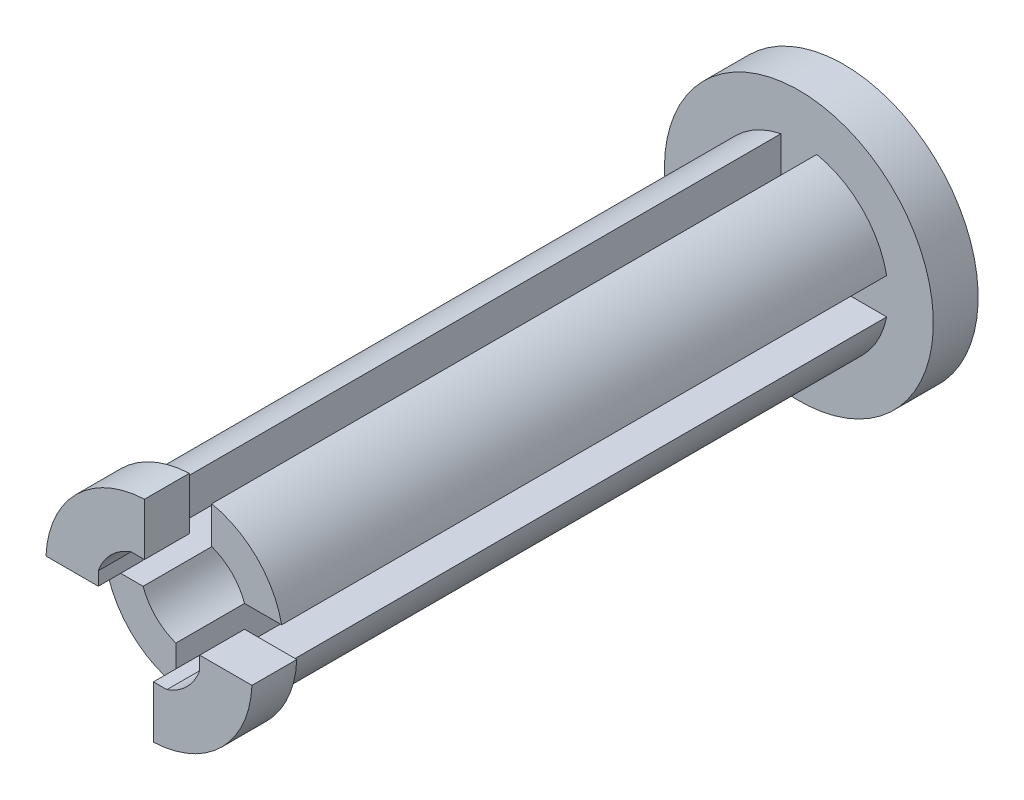
ISO-10303-21;
HEADER;
FILE_DESCRIPTION(('STEP AP214'),'2;1');
FILE_NAME('part.step','',(''),(''),'','','');
FILE_SCHEMA(('AUTOMOTIVE_DESIGN { 1 0 10303 214 1 1 1 1 }'));
ENDSEC;
DATA;
#1=APPLICATION_CONTEXT('core data for automotive mechanical design processes');
#2=APPLICATION_PROTOCOL_DEFINITION('international standard','automotive_design',2000,#1);
#3=PRODUCT_CONTEXT('',#1,'mechanical');
#4=PRODUCT('Part','Part','',(#3));
#5=PRODUCT_RELATED_PRODUCT_CATEGORY('part','',(#4));
#6=PRODUCT_DEFINITION_FORMATION('','',#4);
#7=PRODUCT_DEFINITION_CONTEXT('part definition',#1,'design');
#8=PRODUCT_DEFINITION('design','',#6,#7);
#9=PRODUCT_DEFINITION_SHAPE('','',#8);
#10=(LENGTH_UNIT() NAMED_UNIT(*) SI_UNIT(.MILLI.,.METRE.));
#11=(NAMED_UNIT(*) PLANE_ANGLE_UNIT() SI_UNIT($,.RADIAN.));
#12=(NAMED_UNIT(*) SI_UNIT($,.STERADIAN.) SOLID_ANGLE_UNIT());
#13=UNCERTAINTY_MEASURE_WITH_UNIT(LENGTH_MEASURE(1.E-05),#10,'distance_accuracy_value','');
#14=(GEOMETRIC_REPRESENTATION_CONTEXT(3) GLOBAL_UNCERTAINTY_ASSIGNED_CONTEXT((#13)) GLOBAL_UNIT_ASSIGNED_CONTEXT((#10,
#11,#12)) REPRESENTATION_CONTEXT('',''));
#15=CARTESIAN_POINT('',(0.,0.,0.));
#16=DIRECTION('',(0.,0.,1.));
#17=DIRECTION('',(1.,0.,0.));
#18=AXIS2_PLACEMENT_3D('',#15,#16,#17);
#19=CARTESIAN_POINT('',(0.,0.,0.));
#20=DIRECTION('',(0.,0.,-1.));
#21=DIRECTION('',(-1.,0.,0.));
#22=AXIS2_PLACEMENT_3D('',#19,#20,#21);
#23=PLANE('',#22);
#24=DIRECTION('',(0.,1.,0.));
#25=VECTOR('',#24,1.);
#26=CARTESIAN_POINT('',(0.4,0.,0.));
#27=LINE('',#26,#25);
#28=CARTESIAN_POINT('',(0.4,1.13137084989848,0.));
#29=VERTEX_POINT('',#28);
#30=CARTESIAN_POINT('',(0.4,1.95959179422654,0.));
#31=VERTEX_POINT('',#30);
#32=EDGE_CURVE('E341',#29,#31,#27,.T.);
#33=ORIENTED_EDGE('',*,*,#32,.T.);
#34=CARTESIAN_POINT('',(0.,0.,0.));
#35=DIRECTION('',(0.,0.,1.));
#36=DIRECTION('',(1.,0.,0.));
#37=AXIS2_PLACEMENT_3D('',#34,#35,#36);
#38=CIRCLE('',#37,2.);
#39=CARTESIAN_POINT('',(1.95959179422654,0.4,0.));
#40=VERTEX_POINT('',#39);
#41=EDGE_CURVE('E337',#40,#31,#38,.T.);
#42=ORIENTED_EDGE('',*,*,#41,.F.);
#43=DIRECTION('',(1.,0.,0.));
#44=VECTOR('',#43,1.);
#45=CARTESIAN_POINT('',(0.,0.4,0.));
#46=LINE('',#45,#44);
#47=CARTESIAN_POINT('',(1.13137084989848,0.4,0.));
#48=VERTEX_POINT('',#47);
#49=EDGE_CURVE('E340',#48,#40,#46,.T.);
#50=ORIENTED_EDGE('',*,*,#49,.F.);
#51=CARTESIAN_POINT('',(0.,0.,0.));
#52=DIRECTION('',(0.,0.,1.));
#53=DIRECTION('',(1.,0.,0.));
#54=AXIS2_PLACEMENT_3D('',#51,#52,#53);
#55=CIRCLE('',#54,1.2);
#56=EDGE_CURVE('E330',#48,#29,#55,.T.);
#57=ORIENTED_EDGE('',*,*,#56,.T.);
#58=EDGE_LOOP('',(#33,#42,#50,#57));
#59=FACE_BOUND('',#58,.T.);
#60=DIRECTION('',(1.,0.,0.));
#61=VECTOR('',#60,1.);
#62=CARTESIAN_POINT('',(0.,0.4,0.));
#63=LINE('',#62,#61);
#64=CARTESIAN_POINT('',(-1.95959179422654,0.4,0.));
#65=VERTEX_POINT('',#64);
#66=CARTESIAN_POINT('',(-1.13137084989848,0.4,0.));
#67=VERTEX_POINT('',#66);
#68=EDGE_CURVE('E49',#65,#67,#63,.T.);
#69=ORIENTED_EDGE('',*,*,#68,.F.);
#70=CARTESIAN_POINT('',(0.,0.,0.));
#71=DIRECTION('',(0.,0.,1.));
#72=DIRECTION('',(1.,0.,0.));
#73=AXIS2_PLACEMENT_3D('',#70,#71,#72);
#74=CIRCLE('',#73,2.);
#75=CARTESIAN_POINT('',(-0.4,1.95959179422654,0.));
#76=VERTEX_POINT('',#75);
#77=EDGE_CURVE('E441',#76,#65,#74,.T.);
#78=ORIENTED_EDGE('',*,*,#77,.F.);
#79=DIRECTION('',(0.,1.,0.));
#80=VECTOR('',#79,1.);
#81=CARTESIAN_POINT('',(-0.4,0.,0.));
#82=LINE('',#81,#80);
#83=CARTESIAN_POINT('',(-0.4,1.13137084989848,0.));
#84=VERTEX_POINT('',#83);
#85=EDGE_CURVE('E440',#84,#76,#82,.T.);
#86=ORIENTED_EDGE('',*,*,#85,.F.);
#87=CARTESIAN_POINT('',(0.,0.,0.));
#88=DIRECTION('',(0.,0.,1.));
#89=DIRECTION('',(1.,0.,0.));
#90=AXIS2_PLACEMENT_3D('',#87,#88,#89);
#91=CIRCLE('',#90,1.2);
#92=EDGE_CURVE('E43',#84,#67,#91,.T.);
#93=ORIENTED_EDGE('',*,*,#92,.T.);
#94=EDGE_LOOP('',(#69,#78,#86,#93));
#95=FACE_BOUND('',#94,.T.);
#96=CARTESIAN_POINT('',(0.,0.,0.));
#97=DIRECTION('',(0.,0.,-1.));
#98=DIRECTION('',(-1.,0.,0.));
#99=AXIS2_PLACEMENT_3D('',#96,#97,#98);
#100=CIRCLE('',#99,3.);
#101=CARTESIAN_POINT('',(-3.,0.,0.));
#102=VERTEX_POINT('',#101);
#103=EDGE_CURVE('E352',#102,#102,#100,.T.);
#104=ORIENTED_EDGE('',*,*,#103,.F.);
#105=EDGE_LOOP('',(#104));
#106=FACE_BOUND('',#105,.T.);
#107=CARTESIAN_POINT('',(0.,0.,0.));
#108=DIRECTION('',(0.,0.,1.));
#109=DIRECTION('',(1.,0.,0.));
#110=AXIS2_PLACEMENT_3D('',#107,#108,#109);
#111=CIRCLE('',#110,1.2);
#112=CARTESIAN_POINT('',(-1.13137084989848,-0.4,0.));
#113=VERTEX_POINT('',#112);
#114=CARTESIAN_POINT('',(-0.4,-1.13137084989848,0.));
#115=VERTEX_POINT('',#114);
#116=EDGE_CURVE('E293',#113,#115,#111,.T.);
#117=ORIENTED_EDGE('',*,*,#116,.T.);
#118=DIRECTION('',(0.,1.,0.));
#119=VECTOR('',#118,1.);
#120=CARTESIAN_POINT('',(-0.4,0.,0.));
#121=LINE('',#120,#119);
#122=CARTESIAN_POINT('',(-0.4,-1.95959179422654,0.));
#123=VERTEX_POINT('',#122);
#124=EDGE_CURVE('E303',#123,#115,#121,.T.);
#125=ORIENTED_EDGE('',*,*,#124,.F.);
#126=CARTESIAN_POINT('',(0.,0.,0.));
#127=DIRECTION('',(0.,0.,1.));
#128=DIRECTION('',(1.,0.,0.));
#129=AXIS2_PLACEMENT_3D('',#126,#127,#128);
#130=CIRCLE('',#129,2.);
#131=CARTESIAN_POINT('',(-1.95959179422654,-0.4,0.));
#132=VERTEX_POINT('',#131);
#133=EDGE_CURVE('E279',#132,#123,#130,.T.);
#134=ORIENTED_EDGE('',*,*,#133,.F.);
#135=DIRECTION('',(1.,0.,0.));
#136=VECTOR('',#135,1.);
#137=CARTESIAN_POINT('',(0.,-0.4,0.));
#138=LINE('',#137,#136);
#139=EDGE_CURVE('E297',#132,#113,#138,.T.);
#140=ORIENTED_EDGE('',*,*,#139,.T.);
#141=EDGE_LOOP('',(#117,#125,#134,#140));
#142=FACE_BOUND('',#141,.T.);
#143=DIRECTION('',(1.,0.,0.));
#144=VECTOR('',#143,1.);
#145=CARTESIAN_POINT('',(0.,-0.4,0.));
#146=LINE('',#145,#144);
#147=CARTESIAN_POINT('',(1.13137084989848,-0.4,0.));
#148=VERTEX_POINT('',#147);
#149=CARTESIAN_POINT('',(1.95959179422654,-0.4,0.));
#150=VERTEX_POINT('',#149);
#151=EDGE_CURVE('E61',#148,#150,#146,.T.);
#152=ORIENTED_EDGE('',*,*,#151,.T.);
#153=CARTESIAN_POINT('',(0.,0.,0.));
#154=DIRECTION('',(0.,0.,1.));
#155=DIRECTION('',(1.,0.,0.));
#156=AXIS2_PLACEMENT_3D('',#153,#154,#155);
#157=CIRCLE('',#156,2.);
#158=CARTESIAN_POINT('',(0.4,-1.95959179422654,0.));
#159=VERTEX_POINT('',#158);
#160=EDGE_CURVE('E275',#159,#150,#157,.T.);
#161=ORIENTED_EDGE('',*,*,#160,.F.);
#162=DIRECTION('',(0.,1.,0.));
#163=VECTOR('',#162,1.);
#164=CARTESIAN_POINT('',(0.4,0.,0.));
#165=LINE('',#164,#163);
#166=CARTESIAN_POINT('',(0.4,-1.13137084989848,0.));
#167=VERTEX_POINT('',#166);
#168=EDGE_CURVE('E245',#159,#167,#165,.T.);
#169=ORIENTED_EDGE('',*,*,#168,.T.);
#170=CARTESIAN_POINT('',(0.,0.,0.));
#171=DIRECTION('',(0.,0.,1.));
#172=DIRECTION('',(1.,0.,0.));
#173=AXIS2_PLACEMENT_3D('',#170,#171,#172);
#174=CIRCLE('',#173,1.2);
#175=EDGE_CURVE('E57',#167,#148,#174,.T.);
#176=ORIENTED_EDGE('',*,*,#175,.T.);
#177=EDGE_LOOP('',(#152,#161,#169,#176));
#178=FACE_BOUND('',#177,.T.);
#179=ADVANCED_FACE('F39',(#59,#95,#106,#142,#178),#23,.F.);
#180=CARTESIAN_POINT('',(0.,0.,0.));
#181=DIRECTION('',(0.,0.,1.));
#182=DIRECTION('',(1.,0.,0.));
#183=AXIS2_PLACEMENT_3D('',#180,#181,#182);
#184=CYLINDRICAL_SURFACE('',#183,1.2);
#185=DIRECTION('',(0.,0.,1.));
#186=VECTOR('',#185,1.);
#187=CARTESIAN_POINT('',(-1.13137084989848,0.4,0.));
#188=LINE('',#187,#186);
#189=CARTESIAN_POINT('',(-1.13137084989848,0.4,13.5));
#190=VERTEX_POINT('',#189);
#191=EDGE_CURVE('E11',#67,#190,#188,.T.);
#192=ORIENTED_EDGE('',*,*,#191,.F.);
#193=ORIENTED_EDGE('',*,*,#92,.F.);
#194=DIRECTION('',(0.,0.,1.));
#195=VECTOR('',#194,1.);
#196=CARTESIAN_POINT('',(-0.4,1.13137084989848,0.));
#197=LINE('',#196,#195);
#198=CARTESIAN_POINT('',(-0.4,1.13137084989848,13.5));
#199=VERTEX_POINT('',#198);
#200=EDGE_CURVE('E437',#199,#84,#197,.F.);
#201=ORIENTED_EDGE('',*,*,#200,.F.);
#202=DIRECTION('',(0.,0.,-1.));
#203=VECTOR('',#202,1.);
#204=CARTESIAN_POINT('',(-0.4,1.13137084989848,14.5));
#205=LINE('',#204,#203);
#206=CARTESIAN_POINT('',(-0.4,1.13137084989848,14.5));
#207=VERTEX_POINT('',#206);
#208=EDGE_CURVE('E433',#207,#199,#205,.T.);
#209=ORIENTED_EDGE('',*,*,#208,.F.);
#210=CARTESIAN_POINT('',(0.,0.,14.5));
#211=DIRECTION('',(0.,0.,-1.));
#212=DIRECTION('',(1.,0.,0.));
#213=AXIS2_PLACEMENT_3D('',#210,#211,#212);
#214=CIRCLE('',#213,1.2);
#215=CARTESIAN_POINT('',(-1.13137084989848,0.4,14.5));
#216=VERTEX_POINT('',#215);
#217=EDGE_CURVE('E379',#216,#207,#214,.T.);
#218=ORIENTED_EDGE('',*,*,#217,.F.);
#219=DIRECTION('',(0.,0.,-1.));
#220=VECTOR('',#219,1.);
#221=CARTESIAN_POINT('',(-1.13137084989848,0.4,14.5));
#222=LINE('',#221,#220);
#223=EDGE_CURVE('E399',#216,#190,#222,.T.);
#224=ORIENTED_EDGE('',*,*,#223,.T.);
#225=EDGE_LOOP('',(#192,#193,#201,#209,#218,#224));
#226=FACE_BOUND('',#225,.T.);
#227=ADVANCED_FACE('F479',(#226),#184,.F.);
#228=CARTESIAN_POINT('',(0.,0.,13.5));
#229=DIRECTION('',(0.,0.,-1.));
#230=DIRECTION('',(-1.,0.,0.));
#231=AXIS2_PLACEMENT_3D('',#228,#229,#230);
#232=CYLINDRICAL_SURFACE('',#231,2.);
#233=DIRECTION('',(0.,0.,1.));
#234=VECTOR('',#233,1.);
#235=CARTESIAN_POINT('',(-1.95959179422654,0.4,0.));
#236=LINE('',#235,#234);
#237=CARTESIAN_POINT('',(-1.95959179422654,0.4,13.5));
#238=VERTEX_POINT('',#237);
#239=EDGE_CURVE('E450',#65,#238,#236,.T.);
#240=ORIENTED_EDGE('',*,*,#239,.T.);
#241=CARTESIAN_POINT('',(0.,0.,13.5));
#242=DIRECTION('',(0.,0.,1.));
#243=DIRECTION('',(1.,0.,0.));
#244=AXIS2_PLACEMENT_3D('',#241,#242,#243);
#245=CIRCLE('',#244,2.);
#246=CARTESIAN_POINT('',(-0.4,1.95959179422654,13.5));
#247=VERTEX_POINT('',#246);
#248=EDGE_CURVE('E460',#247,#238,#245,.T.);
#249=ORIENTED_EDGE('',*,*,#248,.F.);
#250=DIRECTION('',(0.,0.,1.));
#251=VECTOR('',#250,1.);
#252=CARTESIAN_POINT('',(-0.4,1.95959179422654,0.));
#253=LINE('',#252,#251);
#254=EDGE_CURVE('E442',#76,#247,#253,.T.);
#255=ORIENTED_EDGE('',*,*,#254,.F.);
#256=ORIENTED_EDGE('',*,*,#77,.T.);
#257=EDGE_LOOP('',(#240,#249,#255,#256));
#258=FACE_BOUND('',#257,.T.);
#259=ADVANCED_FACE('F41',(#258),#232,.T.);
#260=CARTESIAN_POINT('',(-0.4,0.,0.));
#261=DIRECTION('',(1.,0.,0.));
#262=DIRECTION('',(0.,0.,-1.));
#263=AXIS2_PLACEMENT_3D('',#260,#261,#262);
#264=PLANE('',#263);
#265=ORIENTED_EDGE('',*,*,#200,.T.);
#266=ORIENTED_EDGE('',*,*,#85,.T.);
#267=ORIENTED_EDGE('',*,*,#254,.T.);
#268=DIRECTION('',(0.,1.,0.));
#269=VECTOR('',#268,1.);
#270=CARTESIAN_POINT('',(-0.4,0.,13.5));
#271=LINE('',#270,#269);
#272=EDGE_CURVE('E446',#199,#247,#271,.T.);
#273=ORIENTED_EDGE('',*,*,#272,.F.);
#274=EDGE_LOOP('',(#265,#266,#267,#273));
#275=FACE_BOUND('',#274,.T.);
#276=ADVANCED_FACE('F489',(#275),#264,.T.);
#277=CARTESIAN_POINT('',(0.,0.4,0.));
#278=DIRECTION('',(0.,-1.,0.));
#279=DIRECTION('',(0.,0.,-1.));
#280=AXIS2_PLACEMENT_3D('',#277,#278,#279);
#281=PLANE('',#280);
#282=DIRECTION('',(1.,0.,0.));
#283=VECTOR('',#282,1.);
#284=CARTESIAN_POINT('',(0.,0.4,13.5));
#285=LINE('',#284,#283);
#286=EDGE_CURVE('E451',#238,#190,#285,.T.);
#287=ORIENTED_EDGE('',*,*,#286,.F.);
#288=ORIENTED_EDGE('',*,*,#239,.F.);
#289=ORIENTED_EDGE('',*,*,#68,.T.);
#290=ORIENTED_EDGE('',*,*,#191,.T.);
#291=EDGE_LOOP('',(#287,#288,#289,#290));
#292=FACE_BOUND('',#291,.T.);
#293=ADVANCED_FACE('F485',(#292),#281,.T.);
#294=CARTESIAN_POINT('',(0.,0.,13.5));
#295=DIRECTION('',(0.,0.,1.));
#296=DIRECTION('',(1.,0.,0.));
#297=AXIS2_PLACEMENT_3D('',#294,#295,#296);
#298=PLANE('',#297);
#299=ORIENTED_EDGE('',*,*,#248,.T.);
#300=ORIENTED_EDGE('',*,*,#286,.T.);
#301=DIRECTION('',(0.,1.,0.));
#302=VECTOR('',#301,1.);
#303=CARTESIAN_POINT('',(-1.13137084989848,0.4,13.5));
#304=LINE('',#303,#302);
#305=CARTESIAN_POINT('',(-1.13137084989848,0.1,13.5));
#306=VERTEX_POINT('',#305);
#307=EDGE_CURVE('E384',#306,#190,#304,.T.);
#308=ORIENTED_EDGE('',*,*,#307,.F.);
#309=DIRECTION('',(1.,0.,0.));
#310=VECTOR('',#309,1.);
#311=CARTESIAN_POINT('',(-2.29782505861521,0.1,13.5));
#312=LINE('',#311,#310);
#313=CARTESIAN_POINT('',(-2.29782505861521,0.1,13.5));
#314=VERTEX_POINT('',#313);
#315=EDGE_CURVE('E408',#314,#306,#312,.T.);
#316=ORIENTED_EDGE('',*,*,#315,.F.);
#317=CARTESIAN_POINT('',(0.,0.,13.5));
#318=DIRECTION('',(0.,0.,1.));
#319=DIRECTION('',(1.,0.,0.));
#320=AXIS2_PLACEMENT_3D('',#317,#318,#319);
#321=CIRCLE('',#320,2.3);
#322=CARTESIAN_POINT('',(-0.0999999999999998,2.29782505861521,13.5));
#323=VERTEX_POINT('',#322);
#324=EDGE_CURVE('E405',#323,#314,#321,.T.);
#325=ORIENTED_EDGE('',*,*,#324,.F.);
#326=DIRECTION('',(0.,1.,0.));
#327=VECTOR('',#326,1.);
#328=CARTESIAN_POINT('',(-0.1,1.13137084989848,13.5));
#329=LINE('',#328,#327);
#330=CARTESIAN_POINT('',(-0.1,1.13137084989848,13.5));
#331=VERTEX_POINT('',#330);
#332=EDGE_CURVE('E402',#331,#323,#329,.T.);
#333=ORIENTED_EDGE('',*,*,#332,.F.);
#334=DIRECTION('',(1.,0.,0.));
#335=VECTOR('',#334,1.);
#336=CARTESIAN_POINT('',(-0.4,1.13137084989848,13.5));
#337=LINE('',#336,#335);
#338=EDGE_CURVE('E375',#199,#331,#337,.T.);
#339=ORIENTED_EDGE('',*,*,#338,.F.);
#340=ORIENTED_EDGE('',*,*,#272,.T.);
#341=EDGE_LOOP('',(#299,#300,#308,#316,#325,#333,#339,#340));
#342=FACE_BOUND('',#341,.T.);
#343=ADVANCED_FACE('F490',(#342),#298,.F.);
#344=CARTESIAN_POINT('',(-0.4,1.13137084989848,14.5));
#345=DIRECTION('',(0.,1.,0.));
#346=DIRECTION('',(-1.,0.,0.));
#347=AXIS2_PLACEMENT_3D('',#344,#345,#346);
#348=PLANE('',#347);
#349=ORIENTED_EDGE('',*,*,#338,.T.);
#350=DIRECTION('',(0.,0.,-1.));
#351=VECTOR('',#350,1.);
#352=CARTESIAN_POINT('',(-0.1,1.13137084989848,14.5));
#353=LINE('',#352,#351);
#354=CARTESIAN_POINT('',(-0.1,1.13137084989848,14.5));
#355=VERTEX_POINT('',#354);
#356=EDGE_CURVE('E429',#355,#331,#353,.T.);
#357=ORIENTED_EDGE('',*,*,#356,.F.);
#358=DIRECTION('',(1.,0.,0.));
#359=VECTOR('',#358,1.);
#360=CARTESIAN_POINT('',(-0.4,1.13137084989848,14.5));
#361=LINE('',#360,#359);
#362=EDGE_CURVE('E383',#207,#355,#361,.T.);
#363=ORIENTED_EDGE('',*,*,#362,.F.);
#364=ORIENTED_EDGE('',*,*,#208,.T.);
#365=EDGE_LOOP('',(#349,#357,#363,#364));
#366=FACE_BOUND('',#365,.T.);
#367=ADVANCED_FACE('F495',(#366),#348,.F.);
#368=CARTESIAN_POINT('',(-0.1,1.13137084989848,14.5));
#369=DIRECTION('',(-1.,0.,0.));
#370=DIRECTION('',(0.,0.,1.));
#371=AXIS2_PLACEMENT_3D('',#368,#369,#370);
#372=PLANE('',#371);
#373=ORIENTED_EDGE('',*,*,#332,.T.);
#374=DIRECTION('',(0.,0.,-1.));
#375=VECTOR('',#374,1.);
#376=CARTESIAN_POINT('',(-0.0999999999999998,2.29782505861521,14.5));
#377=LINE('',#376,#375);
#378=CARTESIAN_POINT('',(-0.0999999999999998,2.29782505861521,14.5));
#379=VERTEX_POINT('',#378);
#380=EDGE_CURVE('E425',#379,#323,#377,.T.);
#381=ORIENTED_EDGE('',*,*,#380,.F.);
#382=DIRECTION('',(0.,1.,0.));
#383=VECTOR('',#382,1.);
#384=CARTESIAN_POINT('',(-0.1,1.13137084989848,14.5));
#385=LINE('',#384,#383);
#386=EDGE_CURVE('E387',#355,#379,#385,.T.);
#387=ORIENTED_EDGE('',*,*,#386,.F.);
#388=ORIENTED_EDGE('',*,*,#356,.T.);
#389=EDGE_LOOP('',(#373,#381,#387,#388));
#390=FACE_BOUND('',#389,.T.);
#391=ADVANCED_FACE('F514',(#390),#372,.F.);
#392=CARTESIAN_POINT('',(0.,0.,14.5));
#393=DIRECTION('',(0.,0.,-1.));
#394=DIRECTION('',(-1.,0.,0.));
#395=AXIS2_PLACEMENT_3D('',#392,#393,#394);
#396=CYLINDRICAL_SURFACE('',#395,2.3);
#397=ORIENTED_EDGE('',*,*,#324,.T.);
#398=DIRECTION('',(0.,0.,-1.));
#399=VECTOR('',#398,1.);
#400=CARTESIAN_POINT('',(-2.29782505861521,0.1,14.5));
#401=LINE('',#400,#399);
#402=CARTESIAN_POINT('',(-2.29782505861521,0.1,14.5));
#403=VERTEX_POINT('',#402);
#404=EDGE_CURVE('E421',#403,#314,#401,.T.);
#405=ORIENTED_EDGE('',*,*,#404,.F.);
#406=CARTESIAN_POINT('',(0.,0.,14.5));
#407=DIRECTION('',(0.,0.,1.));
#408=DIRECTION('',(1.,0.,0.));
#409=AXIS2_PLACEMENT_3D('',#406,#407,#408);
#410=CIRCLE('',#409,2.3);
#411=EDGE_CURVE('E390',#379,#403,#410,.T.);
#412=ORIENTED_EDGE('',*,*,#411,.F.);
#413=ORIENTED_EDGE('',*,*,#380,.T.);
#414=EDGE_LOOP('',(#397,#405,#412,#413));
#415=FACE_BOUND('',#414,.T.);
#416=ADVANCED_FACE('F510',(#415),#396,.T.);
#417=CARTESIAN_POINT('',(-2.29782505861521,0.1,14.5));
#418=DIRECTION('',(0.,1.,0.));
#419=DIRECTION('',(0.,0.,1.));
#420=AXIS2_PLACEMENT_3D('',#417,#418,#419);
#421=PLANE('',#420);
#422=ORIENTED_EDGE('',*,*,#315,.T.);
#423=DIRECTION('',(0.,0.,-1.));
#424=VECTOR('',#423,1.);
#425=CARTESIAN_POINT('',(-1.13137084989848,0.1,14.5));
#426=LINE('',#425,#424);
#427=CARTESIAN_POINT('',(-1.13137084989848,0.1,14.5));
#428=VERTEX_POINT('',#427);
#429=EDGE_CURVE('E417',#428,#306,#426,.T.);
#430=ORIENTED_EDGE('',*,*,#429,.F.);
#431=DIRECTION('',(1.,0.,0.));
#432=VECTOR('',#431,1.);
#433=CARTESIAN_POINT('',(-2.29782505861521,0.1,14.5));
#434=LINE('',#433,#432);
#435=EDGE_CURVE('E393',#403,#428,#434,.T.);
#436=ORIENTED_EDGE('',*,*,#435,.F.);
#437=ORIENTED_EDGE('',*,*,#404,.T.);
#438=EDGE_LOOP('',(#422,#430,#436,#437));
#439=FACE_BOUND('',#438,.T.);
#440=ADVANCED_FACE('F506',(#439),#421,.F.);
#441=CARTESIAN_POINT('',(-1.13137084989848,0.4,14.5));
#442=DIRECTION('',(-1.,0.,0.));
#443=DIRECTION('',(0.,-1.,0.));
#444=AXIS2_PLACEMENT_3D('',#441,#442,#443);
#445=PLANE('',#444);
#446=ORIENTED_EDGE('',*,*,#307,.T.);
#447=ORIENTED_EDGE('',*,*,#223,.F.);
#448=DIRECTION('',(0.,1.,0.));
#449=VECTOR('',#448,1.);
#450=CARTESIAN_POINT('',(-1.13137084989848,0.4,14.5));
#451=LINE('',#450,#449);
#452=EDGE_CURVE('E396',#428,#216,#451,.T.);
#453=ORIENTED_EDGE('',*,*,#452,.F.);
#454=ORIENTED_EDGE('',*,*,#429,.T.);
#455=EDGE_LOOP('',(#446,#447,#453,#454));
#456=FACE_BOUND('',#455,.T.);
#457=ADVANCED_FACE('F502',(#456),#445,.F.);
#458=CARTESIAN_POINT('',(0.,0.,14.5));
#459=DIRECTION('',(0.,0.,1.));
#460=DIRECTION('',(1.,0.,0.));
#461=AXIS2_PLACEMENT_3D('',#458,#459,#460);
#462=PLANE('',#461);
#463=ORIENTED_EDGE('',*,*,#217,.T.);
#464=ORIENTED_EDGE('',*,*,#362,.T.);
#465=ORIENTED_EDGE('',*,*,#386,.T.);
#466=ORIENTED_EDGE('',*,*,#411,.T.);
#467=ORIENTED_EDGE('',*,*,#435,.T.);
#468=ORIENTED_EDGE('',*,*,#452,.T.);
#469=EDGE_LOOP('',(#463,#464,#465,#466,#467,#468));
#470=FACE_BOUND('',#469,.T.);
#471=ADVANCED_FACE('F497',(#470),#462,.T.);
#472=CARTESIAN_POINT('',(0.,0.,-1.));
#473=DIRECTION('',(0.,0.,1.));
#474=DIRECTION('',(1.,0.,0.));
#475=AXIS2_PLACEMENT_3D('',#472,#473,#474);
#476=CYLINDRICAL_SURFACE('',#475,3.);
#477=CARTESIAN_POINT('',(0.,0.,-1.));
#478=DIRECTION('',(0.,0.,-1.));
#479=DIRECTION('',(-1.,0.,0.));
#480=AXIS2_PLACEMENT_3D('',#477,#478,#479);
#481=CIRCLE('',#480,3.);
#482=CARTESIAN_POINT('',(-3.,0.,-1.));
#483=VERTEX_POINT('',#482);
#484=EDGE_CURVE('E371',#483,#483,#481,.T.);
#485=ORIENTED_EDGE('',*,*,#484,.F.);
#486=EDGE_LOOP('',(#485));
#487=FACE_BOUND('',#486,.T.);
#488=ORIENTED_EDGE('',*,*,#103,.T.);
#489=EDGE_LOOP('',(#488));
#490=FACE_BOUND('',#489,.T.);
#491=ADVANCED_FACE('F533',(#487,#490),#476,.T.);
#492=CARTESIAN_POINT('',(0.,0.,-1.));
#493=DIRECTION('',(0.,0.,-1.));
#494=DIRECTION('',(-1.,0.,0.));
#495=AXIS2_PLACEMENT_3D('',#492,#493,#494);
#496=PLANE('',#495);
#497=ORIENTED_EDGE('',*,*,#484,.T.);
#498=EDGE_LOOP('',(#497));
#499=FACE_BOUND('',#498,.T.);
#500=ADVANCED_FACE('F531',(#499),#496,.T.);
#501=CARTESIAN_POINT('',(0.,0.,0.));
#502=DIRECTION('',(0.,0.,1.));
#503=DIRECTION('',(1.,0.,0.));
#504=AXIS2_PLACEMENT_3D('',#501,#502,#503);
#505=CYLINDRICAL_SURFACE('',#504,1.2);
#506=DIRECTION('',(0.,0.,1.));
#507=VECTOR('',#506,1.);
#508=CARTESIAN_POINT('',(1.13137084989848,0.4,0.));
#509=LINE('',#508,#507);
#510=CARTESIAN_POINT('',(1.13137084989848,0.4,13.5));
#511=VERTEX_POINT('',#510);
#512=EDGE_CURVE('E286',#48,#511,#509,.T.);
#513=ORIENTED_EDGE('',*,*,#512,.T.);
#514=CARTESIAN_POINT('',(0.,0.,13.5));
#515=DIRECTION('',(0.,0.,1.));
#516=DIRECTION('',(1.,0.,0.));
#517=AXIS2_PLACEMENT_3D('',#514,#515,#516);
#518=CIRCLE('',#517,1.2);
#519=CARTESIAN_POINT('',(0.4,1.13137084989848,13.5));
#520=VERTEX_POINT('',#519);
#521=EDGE_CURVE('E331',#511,#520,#518,.T.);
#522=ORIENTED_EDGE('',*,*,#521,.T.);
#523=DIRECTION('',(0.,0.,1.));
#524=VECTOR('',#523,1.);
#525=CARTESIAN_POINT('',(0.4,1.13137084989848,0.));
#526=LINE('',#525,#524);
#527=EDGE_CURVE('E326',#520,#29,#526,.F.);
#528=ORIENTED_EDGE('',*,*,#527,.T.);
#529=ORIENTED_EDGE('',*,*,#56,.F.);
#530=EDGE_LOOP('',(#513,#522,#528,#529));
#531=FACE_BOUND('',#530,.T.);
#532=ADVANCED_FACE('F567',(#531),#505,.F.);
#533=CARTESIAN_POINT('',(0.,0.,13.5));
#534=DIRECTION('',(0.,0.,1.));
#535=DIRECTION('',(1.,0.,0.));
#536=AXIS2_PLACEMENT_3D('',#533,#534,#535);
#537=PLANE('',#536);
#538=ORIENTED_EDGE('',*,*,#521,.F.);
#539=DIRECTION('',(1.,0.,0.));
#540=VECTOR('',#539,1.);
#541=CARTESIAN_POINT('',(0.,0.4,13.5));
#542=LINE('',#541,#540);
#543=CARTESIAN_POINT('',(1.95959179422654,0.4,13.5));
#544=VERTEX_POINT('',#543);
#545=EDGE_CURVE('E345',#511,#544,#542,.T.);
#546=ORIENTED_EDGE('',*,*,#545,.T.);
#547=CARTESIAN_POINT('',(0.,0.,13.5));
#548=DIRECTION('',(0.,0.,1.));
#549=DIRECTION('',(1.,0.,0.));
#550=AXIS2_PLACEMENT_3D('',#547,#548,#549);
#551=CIRCLE('',#550,2.);
#552=CARTESIAN_POINT('',(0.4,1.95959179422654,13.5));
#553=VERTEX_POINT('',#552);
#554=EDGE_CURVE('E356',#544,#553,#551,.T.);
#555=ORIENTED_EDGE('',*,*,#554,.T.);
#556=DIRECTION('',(0.,1.,0.));
#557=VECTOR('',#556,1.);
#558=CARTESIAN_POINT('',(0.4,0.,13.5));
#559=LINE('',#558,#557);
#560=EDGE_CURVE('E336',#520,#553,#559,.T.);
#561=ORIENTED_EDGE('',*,*,#560,.F.);
#562=EDGE_LOOP('',(#538,#546,#555,#561));
#563=FACE_BOUND('',#562,.T.);
#564=ADVANCED_FACE('F574',(#563),#537,.T.);
#565=CARTESIAN_POINT('',(0.,0.,13.5));
#566=DIRECTION('',(0.,0.,-1.));
#567=DIRECTION('',(-1.,0.,0.));
#568=AXIS2_PLACEMENT_3D('',#565,#566,#567);
#569=CYLINDRICAL_SURFACE('',#568,2.);
#570=DIRECTION('',(0.,0.,1.));
#571=VECTOR('',#570,1.);
#572=CARTESIAN_POINT('',(1.95959179422654,0.4,0.));
#573=LINE('',#572,#571);
#574=EDGE_CURVE('E349',#40,#544,#573,.T.);
#575=ORIENTED_EDGE('',*,*,#574,.F.);
#576=ORIENTED_EDGE('',*,*,#41,.T.);
#577=DIRECTION('',(0.,0.,-1.));
#578=VECTOR('',#577,1.);
#579=CARTESIAN_POINT('',(0.4,1.95959179422654,13.5));
#580=LINE('',#579,#578);
#581=EDGE_CURVE('E332',#31,#553,#580,.F.);
#582=ORIENTED_EDGE('',*,*,#581,.T.);
#583=ORIENTED_EDGE('',*,*,#554,.F.);
#584=EDGE_LOOP('',(#575,#576,#582,#583));
#585=FACE_BOUND('',#584,.T.);
#586=ADVANCED_FACE('F582',(#585),#569,.T.);
#587=CARTESIAN_POINT('',(0.4,0.,0.));
#588=DIRECTION('',(1.,0.,0.));
#589=DIRECTION('',(0.,0.,-1.));
#590=AXIS2_PLACEMENT_3D('',#587,#588,#589);
#591=PLANE('',#590);
#592=ORIENTED_EDGE('',*,*,#32,.F.);
#593=ORIENTED_EDGE('',*,*,#527,.F.);
#594=ORIENTED_EDGE('',*,*,#560,.T.);
#595=ORIENTED_EDGE('',*,*,#581,.F.);
#596=EDGE_LOOP('',(#592,#593,#594,#595));
#597=FACE_BOUND('',#596,.T.);
#598=ADVANCED_FACE('F590',(#597),#591,.F.);
#599=CARTESIAN_POINT('',(0.,0.4,0.));
#600=DIRECTION('',(0.,-1.,0.));
#601=DIRECTION('',(0.,0.,-1.));
#602=AXIS2_PLACEMENT_3D('',#599,#600,#601);
#603=PLANE('',#602);
#604=ORIENTED_EDGE('',*,*,#545,.F.);
#605=ORIENTED_EDGE('',*,*,#512,.F.);
#606=ORIENTED_EDGE('',*,*,#49,.T.);
#607=ORIENTED_EDGE('',*,*,#574,.T.);
#608=EDGE_LOOP('',(#604,#605,#606,#607));
#609=FACE_BOUND('',#608,.T.);
#610=ADVANCED_FACE('F597',(#609),#603,.T.);
#611=CARTESIAN_POINT('',(0.,0.,13.5));
#612=DIRECTION('',(0.,0.,-1.));
#613=DIRECTION('',(-1.,0.,0.));
#614=AXIS2_PLACEMENT_3D('',#611,#612,#613);
#615=CYLINDRICAL_SURFACE('',#614,2.);
#616=CARTESIAN_POINT('',(0.,0.,13.5));
#617=DIRECTION('',(0.,0.,1.));
#618=DIRECTION('',(1.,0.,0.));
#619=AXIS2_PLACEMENT_3D('',#616,#617,#618);
#620=CIRCLE('',#619,2.);
#621=CARTESIAN_POINT('',(-1.95959179422654,-0.4,13.5));
#622=VERTEX_POINT('',#621);
#623=CARTESIAN_POINT('',(-0.4,-1.95959179422654,13.5));
#624=VERTEX_POINT('',#623);
#625=EDGE_CURVE('E308',#622,#624,#620,.T.);
#626=ORIENTED_EDGE('',*,*,#625,.F.);
#627=DIRECTION('',(0.,0.,1.));
#628=VECTOR('',#627,1.);
#629=CARTESIAN_POINT('',(-1.95959179422654,-0.4,0.));
#630=LINE('',#629,#628);
#631=EDGE_CURVE('E283',#132,#622,#630,.T.);
#632=ORIENTED_EDGE('',*,*,#631,.F.);
#633=ORIENTED_EDGE('',*,*,#133,.T.);
#634=DIRECTION('',(0.,0.,1.));
#635=VECTOR('',#634,1.);
#636=CARTESIAN_POINT('',(-0.4,-1.95959179422654,0.));
#637=LINE('',#636,#635);
#638=EDGE_CURVE('E304',#123,#624,#637,.T.);
#639=ORIENTED_EDGE('',*,*,#638,.T.);
#640=EDGE_LOOP('',(#626,#632,#633,#639));
#641=FACE_BOUND('',#640,.T.);
#642=ADVANCED_FACE('F605',(#641),#615,.T.);
#643=CARTESIAN_POINT('',(0.,0.,13.5));
#644=DIRECTION('',(0.,0.,1.));
#645=DIRECTION('',(1.,0.,0.));
#646=AXIS2_PLACEMENT_3D('',#643,#644,#645);
#647=PLANE('',#646);
#648=DIRECTION('',(1.,0.,0.));
#649=VECTOR('',#648,1.);
#650=CARTESIAN_POINT('',(0.,-0.4,13.5));
#651=LINE('',#650,#649);
#652=CARTESIAN_POINT('',(-1.13137084989848,-0.4,13.5));
#653=VERTEX_POINT('',#652);
#654=EDGE_CURVE('E287',#622,#653,#651,.T.);
#655=ORIENTED_EDGE('',*,*,#654,.F.);
#656=ORIENTED_EDGE('',*,*,#625,.T.);
#657=DIRECTION('',(0.,1.,0.));
#658=VECTOR('',#657,1.);
#659=CARTESIAN_POINT('',(-0.4,0.,13.5));
#660=LINE('',#659,#658);
#661=CARTESIAN_POINT('',(-0.4,-1.13137084989848,13.5));
#662=VERTEX_POINT('',#661);
#663=EDGE_CURVE('E300',#624,#662,#660,.T.);
#664=ORIENTED_EDGE('',*,*,#663,.T.);
#665=CARTESIAN_POINT('',(0.,0.,13.5));
#666=DIRECTION('',(0.,0.,1.));
#667=DIRECTION('',(1.,0.,0.));
#668=AXIS2_PLACEMENT_3D('',#665,#666,#667);
#669=CIRCLE('',#668,1.2);
#670=EDGE_CURVE('E292',#653,#662,#669,.T.);
#671=ORIENTED_EDGE('',*,*,#670,.F.);
#672=EDGE_LOOP('',(#655,#656,#664,#671));
#673=FACE_BOUND('',#672,.T.);
#674=ADVANCED_FACE('F613',(#673),#647,.T.);
#675=CARTESIAN_POINT('',(0.,0.,0.));
#676=DIRECTION('',(0.,0.,1.));
#677=DIRECTION('',(1.,0.,0.));
#678=AXIS2_PLACEMENT_3D('',#675,#676,#677);
#679=CYLINDRICAL_SURFACE('',#678,1.2);
#680=ORIENTED_EDGE('',*,*,#116,.F.);
#681=DIRECTION('',(0.,0.,1.));
#682=VECTOR('',#681,1.);
#683=CARTESIAN_POINT('',(-1.13137084989848,-0.4,0.));
#684=LINE('',#683,#682);
#685=EDGE_CURVE('E288',#113,#653,#684,.T.);
#686=ORIENTED_EDGE('',*,*,#685,.T.);
#687=ORIENTED_EDGE('',*,*,#670,.T.);
#688=DIRECTION('',(0.,0.,1.));
#689=VECTOR('',#688,1.);
#690=CARTESIAN_POINT('',(-0.4,-1.13137084989848,0.));
#691=LINE('',#690,#689);
#692=EDGE_CURVE('E296',#115,#662,#691,.T.);
#693=ORIENTED_EDGE('',*,*,#692,.F.);
#694=EDGE_LOOP('',(#680,#686,#687,#693));
#695=FACE_BOUND('',#694,.T.);
#696=ADVANCED_FACE('F621',(#695),#679,.F.);
#697=CARTESIAN_POINT('',(-0.4,0.,0.));
#698=DIRECTION('',(1.,0.,0.));
#699=DIRECTION('',(0.,0.,-1.));
#700=AXIS2_PLACEMENT_3D('',#697,#698,#699);
#701=PLANE('',#700);
#702=ORIENTED_EDGE('',*,*,#663,.F.);
#703=ORIENTED_EDGE('',*,*,#638,.F.);
#704=ORIENTED_EDGE('',*,*,#124,.T.);
#705=ORIENTED_EDGE('',*,*,#692,.T.);
#706=EDGE_LOOP('',(#702,#703,#704,#705));
#707=FACE_BOUND('',#706,.T.);
#708=ADVANCED_FACE('F629',(#707),#701,.T.);
#709=CARTESIAN_POINT('',(0.,-0.4,0.));
#710=DIRECTION('',(0.,-1.,0.));
#711=DIRECTION('',(0.,0.,-1.));
#712=AXIS2_PLACEMENT_3D('',#709,#710,#711);
#713=PLANE('',#712);
#714=ORIENTED_EDGE('',*,*,#654,.T.);
#715=ORIENTED_EDGE('',*,*,#685,.F.);
#716=ORIENTED_EDGE('',*,*,#139,.F.);
#717=ORIENTED_EDGE('',*,*,#631,.T.);
#718=EDGE_LOOP('',(#714,#715,#716,#717));
#719=FACE_BOUND('',#718,.T.);
#720=ADVANCED_FACE('F637',(#719),#713,.F.);
#721=CARTESIAN_POINT('',(0.,0.,0.));
#722=DIRECTION('',(0.,0.,1.));
#723=DIRECTION('',(1.,0.,0.));
#724=AXIS2_PLACEMENT_3D('',#721,#722,#723);
#725=CYLINDRICAL_SURFACE('',#724,1.2);
#726=ORIENTED_EDGE('',*,*,#175,.F.);
#727=DIRECTION('',(0.,0.,1.));
#728=VECTOR('',#727,1.);
#729=CARTESIAN_POINT('',(0.4,-1.13137084989848,0.));
#730=LINE('',#729,#728);
#731=CARTESIAN_POINT('',(0.4,-1.13137084989848,13.5));
#732=VERTEX_POINT('',#731);
#733=EDGE_CURVE('E239',#167,#732,#730,.T.);
#734=ORIENTED_EDGE('',*,*,#733,.T.);
#735=DIRECTION('',(0.,0.,-1.));
#736=VECTOR('',#735,1.);
#737=CARTESIAN_POINT('',(0.4,-1.13137084989848,14.5));
#738=LINE('',#737,#736);
#739=CARTESIAN_POINT('',(0.4,-1.13137084989848,14.5));
#740=VERTEX_POINT('',#739);
#741=EDGE_CURVE('E216',#740,#732,#738,.T.);
#742=ORIENTED_EDGE('',*,*,#741,.F.);
#743=CARTESIAN_POINT('',(0.,0.,14.5));
#744=DIRECTION('',(0.,0.,-1.));
#745=DIRECTION('',(1.,0.,0.));
#746=AXIS2_PLACEMENT_3D('',#743,#744,#745);
#747=CIRCLE('',#746,1.2);
#748=CARTESIAN_POINT('',(1.13137084989848,-0.4,14.5));
#749=VERTEX_POINT('',#748);
#750=EDGE_CURVE('E224',#749,#740,#747,.T.);
#751=ORIENTED_EDGE('',*,*,#750,.F.);
#752=DIRECTION('',(0.,0.,-1.));
#753=VECTOR('',#752,1.);
#754=CARTESIAN_POINT('',(1.13137084989848,-0.4,14.5));
#755=LINE('',#754,#753);
#756=CARTESIAN_POINT('',(1.13137084989848,-0.4,13.5));
#757=VERTEX_POINT('',#756);
#758=EDGE_CURVE('E850',#749,#757,#755,.T.);
#759=ORIENTED_EDGE('',*,*,#758,.T.);
#760=DIRECTION('',(0.,0.,1.));
#761=VECTOR('',#760,1.);
#762=CARTESIAN_POINT('',(1.13137084989848,-0.4,0.));
#763=LINE('',#762,#761);
#764=EDGE_CURVE('E253',#148,#757,#763,.T.);
#765=ORIENTED_EDGE('',*,*,#764,.F.);
#766=EDGE_LOOP('',(#726,#734,#742,#751,#759,#765));
#767=FACE_BOUND('',#766,.T.);
#768=ADVANCED_FACE('F237',(#767),#725,.F.);
#769=CARTESIAN_POINT('',(0.,0.,13.5));
#770=DIRECTION('',(0.,0.,-1.));
#771=DIRECTION('',(-1.,0.,0.));
#772=AXIS2_PLACEMENT_3D('',#769,#770,#771);
#773=CYLINDRICAL_SURFACE('',#772,2.);
#774=CARTESIAN_POINT('',(0.,0.,13.5));
#775=DIRECTION('',(0.,0.,1.));
#776=DIRECTION('',(1.,0.,0.));
#777=AXIS2_PLACEMENT_3D('',#774,#775,#776);
#778=CIRCLE('',#777,2.);
#779=CARTESIAN_POINT('',(0.4,-1.95959179422654,13.5));
#780=VERTEX_POINT('',#779);
#781=CARTESIAN_POINT('',(1.95959179422654,-0.4,13.5));
#782=VERTEX_POINT('',#781);
#783=EDGE_CURVE('E276',#780,#782,#778,.T.);
#784=ORIENTED_EDGE('',*,*,#783,.F.);
#785=DIRECTION('',(0.,0.,1.));
#786=VECTOR('',#785,1.);
#787=CARTESIAN_POINT('',(0.4,-1.95959179422654,0.));
#788=LINE('',#787,#786);
#789=EDGE_CURVE('E266',#159,#780,#788,.T.);
#790=ORIENTED_EDGE('',*,*,#789,.F.);
#791=ORIENTED_EDGE('',*,*,#160,.T.);
#792=DIRECTION('',(0.,0.,1.));
#793=VECTOR('',#792,1.);
#794=CARTESIAN_POINT('',(1.95959179422654,-0.4,0.));
#795=LINE('',#794,#793);
#796=EDGE_CURVE('E258',#150,#782,#795,.T.);
#797=ORIENTED_EDGE('',*,*,#796,.T.);
#798=EDGE_LOOP('',(#784,#790,#791,#797));
#799=FACE_BOUND('',#798,.T.);
#800=ADVANCED_FACE('F652',(#799),#773,.T.);
#801=CARTESIAN_POINT('',(0.,-0.4,0.));
#802=DIRECTION('',(0.,-1.,0.));
#803=DIRECTION('',(0.,0.,-1.));
#804=AXIS2_PLACEMENT_3D('',#801,#802,#803);
#805=PLANE('',#804);
#806=DIRECTION('',(1.,0.,0.));
#807=VECTOR('',#806,1.);
#808=CARTESIAN_POINT('',(0.,-0.4,13.5));
#809=LINE('',#808,#807);
#810=EDGE_CURVE('E254',#757,#782,#809,.T.);
#811=ORIENTED_EDGE('',*,*,#810,.T.);
#812=ORIENTED_EDGE('',*,*,#796,.F.);
#813=ORIENTED_EDGE('',*,*,#151,.F.);
#814=ORIENTED_EDGE('',*,*,#764,.T.);
#815=EDGE_LOOP('',(#811,#812,#813,#814));
#816=FACE_BOUND('',#815,.T.);
#817=ADVANCED_FACE('F659',(#816),#805,.F.);
#818=CARTESIAN_POINT('',(0.4,0.,0.));
#819=DIRECTION('',(1.,0.,0.));
#820=DIRECTION('',(0.,0.,-1.));
#821=AXIS2_PLACEMENT_3D('',#818,#819,#820);
#822=PLANE('',#821);
#823=DIRECTION('',(0.,1.,0.));
#824=VECTOR('',#823,1.);
#825=CARTESIAN_POINT('',(0.4,0.,13.5));
#826=LINE('',#825,#824);
#827=EDGE_CURVE('E241',#780,#732,#826,.T.);
#828=ORIENTED_EDGE('',*,*,#827,.T.);
#829=ORIENTED_EDGE('',*,*,#733,.F.);
#830=ORIENTED_EDGE('',*,*,#168,.F.);
#831=ORIENTED_EDGE('',*,*,#789,.T.);
#832=EDGE_LOOP('',(#828,#829,#830,#831));
#833=FACE_BOUND('',#832,.T.);
#834=ADVANCED_FACE('F667',(#833),#822,.F.);
#835=CARTESIAN_POINT('',(0.4,-1.13137084989848,14.5));
#836=DIRECTION('',(0.,-1.,0.));
#837=DIRECTION('',(0.,0.,-1.));
#838=AXIS2_PLACEMENT_3D('',#835,#836,#837);
#839=PLANE('',#838);
#840=DIRECTION('',(-1.,0.,0.));
#841=VECTOR('',#840,1.);
#842=CARTESIAN_POINT('',(0.4,-1.13137084989848,13.5));
#843=LINE('',#842,#841);
#844=CARTESIAN_POINT('',(0.1,-1.13137084989848,13.5));
#845=VERTEX_POINT('',#844);
#846=EDGE_CURVE('E842',#732,#845,#843,.T.);
#847=ORIENTED_EDGE('',*,*,#846,.T.);
#848=DIRECTION('',(0.,0.,-1.));
#849=VECTOR('',#848,1.);
#850=CARTESIAN_POINT('',(0.1,-1.13137084989848,14.5));
#851=LINE('',#850,#849);
#852=CARTESIAN_POINT('',(0.1,-1.13137084989848,14.5));
#853=VERTEX_POINT('',#852);
#854=EDGE_CURVE('E219',#853,#845,#851,.T.);
#855=ORIENTED_EDGE('',*,*,#854,.F.);
#856=DIRECTION('',(-1.,0.,0.));
#857=VECTOR('',#856,1.);
#858=CARTESIAN_POINT('',(0.4,-1.13137084989848,14.5));
#859=LINE('',#858,#857);
#860=EDGE_CURVE('E212',#740,#853,#859,.T.);
#861=ORIENTED_EDGE('',*,*,#860,.F.);
#862=ORIENTED_EDGE('',*,*,#741,.T.);
#863=EDGE_LOOP('',(#847,#855,#861,#862));
#864=FACE_BOUND('',#863,.T.);
#865=ADVANCED_FACE('F214',(#864),#839,.F.);
#866=CARTESIAN_POINT('',(0.1,-1.13137084989848,14.5));
#867=DIRECTION('',(1.,0.,0.));
#868=DIRECTION('',(0.,0.,-1.));
#869=AXIS2_PLACEMENT_3D('',#866,#867,#868);
#870=PLANE('',#869);
#871=DIRECTION('',(0.,-1.,0.));
#872=VECTOR('',#871,1.);
#873=CARTESIAN_POINT('',(0.1,-1.13137084989848,13.5));
#874=LINE('',#873,#872);
#875=CARTESIAN_POINT('',(0.1,-2.29782505861521,13.5));
#876=VERTEX_POINT('',#875);
#877=EDGE_CURVE('E876',#845,#876,#874,.T.);
#878=ORIENTED_EDGE('',*,*,#877,.T.);
#879=DIRECTION('',(0.,0.,-1.));
#880=VECTOR('',#879,1.);
#881=CARTESIAN_POINT('',(0.1,-2.29782505861521,14.5));
#882=LINE('',#881,#880);
#883=CARTESIAN_POINT('',(0.1,-2.29782505861521,14.5));
#884=VERTEX_POINT('',#883);
#885=EDGE_CURVE('E247',#884,#876,#882,.T.);
#886=ORIENTED_EDGE('',*,*,#885,.F.);
#887=DIRECTION('',(0.,-1.,0.));
#888=VECTOR('',#887,1.);
#889=CARTESIAN_POINT('',(0.1,-1.13137084989848,14.5));
#890=LINE('',#889,#888);
#891=EDGE_CURVE('E223',#853,#884,#890,.T.);
#892=ORIENTED_EDGE('',*,*,#891,.F.);
#893=ORIENTED_EDGE('',*,*,#854,.T.);
#894=EDGE_LOOP('',(#878,#886,#892,#893));
#895=FACE_BOUND('',#894,.T.);
#896=ADVANCED_FACE('F682',(#895),#870,.F.);
#897=CARTESIAN_POINT('',(0.,0.,14.5));
#898=DIRECTION('',(0.,0.,-1.));
#899=DIRECTION('',(-1.,0.,0.));
#900=AXIS2_PLACEMENT_3D('',#897,#898,#899);
#901=CYLINDRICAL_SURFACE('',#900,2.3);
#902=CARTESIAN_POINT('',(0.,0.,13.5));
#903=DIRECTION('',(0.,0.,1.));
#904=DIRECTION('',(1.,0.,0.));
#905=AXIS2_PLACEMENT_3D('',#902,#903,#904);
#906=CIRCLE('',#905,2.3);
#907=CARTESIAN_POINT('',(2.29782505861521,-0.100000000000002,13.5));
#908=VERTEX_POINT('',#907);
#909=EDGE_CURVE('E874',#876,#908,#906,.T.);
#910=ORIENTED_EDGE('',*,*,#909,.T.);
#911=DIRECTION('',(0.,0.,-1.));
#912=VECTOR('',#911,1.);
#913=CARTESIAN_POINT('',(2.29782505861521,-0.100000000000002,14.5));
#914=LINE('',#913,#912);
#915=CARTESIAN_POINT('',(2.29782505861521,-0.100000000000002,14.5));
#916=VERTEX_POINT('',#915);
#917=EDGE_CURVE('E860',#916,#908,#914,.T.);
#918=ORIENTED_EDGE('',*,*,#917,.F.);
#919=CARTESIAN_POINT('',(0.,0.,14.5));
#920=DIRECTION('',(0.,0.,1.));
#921=DIRECTION('',(1.,0.,0.));
#922=AXIS2_PLACEMENT_3D('',#919,#920,#921);
#923=CIRCLE('',#922,2.3);
#924=EDGE_CURVE('E875',#884,#916,#923,.T.);
#925=ORIENTED_EDGE('',*,*,#924,.F.);
#926=ORIENTED_EDGE('',*,*,#885,.T.);
#927=EDGE_LOOP('',(#910,#918,#925,#926));
#928=FACE_BOUND('',#927,.T.);
#929=ADVANCED_FACE('F689',(#928),#901,.T.);
#930=CARTESIAN_POINT('',(2.29782505861521,-0.1,14.5));
#931=DIRECTION('',(0.,-1.,0.));
#932=DIRECTION('',(0.,0.,-1.));
#933=AXIS2_PLACEMENT_3D('',#930,#931,#932);
#934=PLANE('',#933);
#935=DIRECTION('',(-1.,0.,0.));
#936=VECTOR('',#935,1.);
#937=CARTESIAN_POINT('',(2.29782505861521,-0.1,13.5));
#938=LINE('',#937,#936);
#939=CARTESIAN_POINT('',(1.13137084989848,-0.1,13.5));
#940=VERTEX_POINT('',#939);
#941=EDGE_CURVE('E854',#908,#940,#938,.T.);
#942=ORIENTED_EDGE('',*,*,#941,.T.);
#943=DIRECTION('',(0.,0.,-1.));
#944=VECTOR('',#943,1.);
#945=CARTESIAN_POINT('',(1.13137084989848,-0.1,14.5));
#946=LINE('',#945,#944);
#947=CARTESIAN_POINT('',(1.13137084989848,-0.1,14.5));
#948=VERTEX_POINT('',#947);
#949=EDGE_CURVE('E852',#948,#940,#946,.T.);
#950=ORIENTED_EDGE('',*,*,#949,.F.);
#951=DIRECTION('',(-1.,0.,0.));
#952=VECTOR('',#951,1.);
#953=CARTESIAN_POINT('',(2.29782505861521,-0.1,14.5));
#954=LINE('',#953,#952);
#955=EDGE_CURVE('E862',#916,#948,#954,.T.);
#956=ORIENTED_EDGE('',*,*,#955,.F.);
#957=ORIENTED_EDGE('',*,*,#917,.T.);
#958=EDGE_LOOP('',(#942,#950,#956,#957));
#959=FACE_BOUND('',#958,.T.);
#960=ADVANCED_FACE('F697',(#959),#934,.F.);
#961=CARTESIAN_POINT('',(1.13137084989848,-0.4,14.5));
#962=DIRECTION('',(1.,0.,0.));
#963=DIRECTION('',(0.,1.,0.));
#964=AXIS2_PLACEMENT_3D('',#961,#962,#963);
#965=PLANE('',#964);
#966=DIRECTION('',(0.,-1.,0.));
#967=VECTOR('',#966,1.);
#968=CARTESIAN_POINT('',(1.13137084989848,-0.4,13.5));
#969=LINE('',#968,#967);
#970=EDGE_CURVE('E234',#940,#757,#969,.T.);
#971=ORIENTED_EDGE('',*,*,#970,.T.);
#972=ORIENTED_EDGE('',*,*,#758,.F.);
#973=DIRECTION('',(0.,-1.,0.));
#974=VECTOR('',#973,1.);
#975=CARTESIAN_POINT('',(1.13137084989848,-0.4,14.5));
#976=LINE('',#975,#974);
#977=EDGE_CURVE('E229',#948,#749,#976,.T.);
#978=ORIENTED_EDGE('',*,*,#977,.F.);
#979=ORIENTED_EDGE('',*,*,#949,.T.);
#980=EDGE_LOOP('',(#971,#972,#978,#979));
#981=FACE_BOUND('',#980,.T.);
#982=ADVANCED_FACE('F705',(#981),#965,.F.);
#983=CARTESIAN_POINT('',(0.,0.,14.5));
#984=DIRECTION('',(0.,0.,1.));
#985=DIRECTION('',(1.,0.,0.));
#986=AXIS2_PLACEMENT_3D('',#983,#984,#985);
#987=PLANE('',#986);
#988=ORIENTED_EDGE('',*,*,#750,.T.);
#989=ORIENTED_EDGE('',*,*,#860,.T.);
#990=ORIENTED_EDGE('',*,*,#891,.T.);
#991=ORIENTED_EDGE('',*,*,#924,.T.);
#992=ORIENTED_EDGE('',*,*,#955,.T.);
#993=ORIENTED_EDGE('',*,*,#977,.T.);
#994=EDGE_LOOP('',(#988,#989,#990,#991,#992,#993));
#995=FACE_BOUND('',#994,.T.);
#996=ADVANCED_FACE('F227',(#995),#987,.T.);
#997=CARTESIAN_POINT('',(0.,0.,13.5));
#998=DIRECTION('',(0.,0.,1.));
#999=DIRECTION('',(1.,0.,0.));
#1000=AXIS2_PLACEMENT_3D('',#997,#998,#999);
#1001=PLANE('',#1000);
#1002=ORIENTED_EDGE('',*,*,#827,.F.);
#1003=ORIENTED_EDGE('',*,*,#783,.T.);
#1004=ORIENTED_EDGE('',*,*,#810,.F.);
#1005=ORIENTED_EDGE('',*,*,#970,.F.);
#1006=ORIENTED_EDGE('',*,*,#941,.F.);
#1007=ORIENTED_EDGE('',*,*,#909,.F.);
#1008=ORIENTED_EDGE('',*,*,#877,.F.);
#1009=ORIENTED_EDGE('',*,*,#846,.F.);
#1010=EDGE_LOOP('',(#1002,#1003,#1004,#1005,#1006,#1007,#1008,#1009));
#1011=FACE_BOUND('',#1010,.T.);
#1012=ADVANCED_FACE('F720',(#1011),#1001,.F.);
#1013=CLOSED_SHELL('',(#179,#227,#259,#276,#293,#343,#367,#391,#416,#440,#457,#471,#491,#500,
#532,#564,#586,#598,#610,#642,#674,#696,#708,#720,#768,#800,#817,#834,#865,#896,#929,#960,#982,
#996,#1012));
#1014=MANIFOLD_SOLID_BREP('B2',#1013);
#1015=ADVANCED_BREP_SHAPE_REPRESENTATION('',(#18,#1014),#14);
#1016=SHAPE_DEFINITION_REPRESENTATION(#9,#1015);
ENDSEC;
END-ISO-10303-21;
